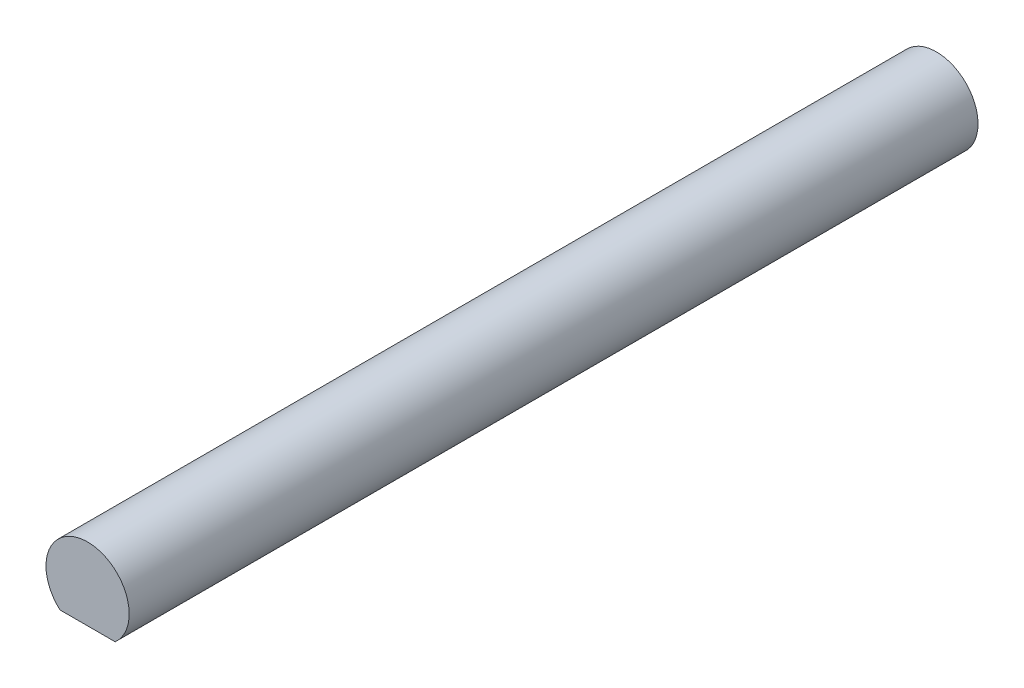
ISO-10303-21;
HEADER;
FILE_DESCRIPTION(('STEP AP214'),'2;1');
FILE_NAME('part.step','',(''),(''),'','','');
FILE_SCHEMA(('AUTOMOTIVE_DESIGN { 1 0 10303 214 1 1 1 1 }'));
ENDSEC;
DATA;
#1=APPLICATION_CONTEXT('core data for automotive mechanical design processes');
#2=APPLICATION_PROTOCOL_DEFINITION('international standard','automotive_design',2000,#1);
#3=PRODUCT_CONTEXT('',#1,'mechanical');
#4=PRODUCT('Part','Part','',(#3));
#5=PRODUCT_RELATED_PRODUCT_CATEGORY('part','',(#4));
#6=PRODUCT_DEFINITION_FORMATION('','',#4);
#7=PRODUCT_DEFINITION_CONTEXT('part definition',#1,'design');
#8=PRODUCT_DEFINITION('design','',#6,#7);
#9=PRODUCT_DEFINITION_SHAPE('','',#8);
#10=(LENGTH_UNIT() NAMED_UNIT(*) SI_UNIT(.MILLI.,.METRE.));
#11=(NAMED_UNIT(*) PLANE_ANGLE_UNIT() SI_UNIT($,.RADIAN.));
#12=(NAMED_UNIT(*) SI_UNIT($,.STERADIAN.) SOLID_ANGLE_UNIT());
#13=UNCERTAINTY_MEASURE_WITH_UNIT(LENGTH_MEASURE(1.E-05),#10,'distance_accuracy_value','');
#14=(GEOMETRIC_REPRESENTATION_CONTEXT(3) GLOBAL_UNCERTAINTY_ASSIGNED_CONTEXT((#13)) GLOBAL_UNIT_ASSIGNED_CONTEXT((#10,
#11,#12)) REPRESENTATION_CONTEXT('',''));
#15=CARTESIAN_POINT('',(0.,0.,0.));
#16=DIRECTION('',(0.,0.,1.));
#17=DIRECTION('',(1.,0.,0.));
#18=AXIS2_PLACEMENT_3D('',#15,#16,#17);
#19=CARTESIAN_POINT('',(0.,0.,30.));
#20=DIRECTION('',(0.,0.,-1.));
#21=DIRECTION('',(-1.,0.,0.));
#22=AXIS2_PLACEMENT_3D('',#19,#20,#21);
#23=CYLINDRICAL_SURFACE('',#22,1.47);
#24=CARTESIAN_POINT('',(0.,0.,0.));
#25=DIRECTION('',(0.,0.,1.));
#26=DIRECTION('',(1.,0.,0.));
#27=AXIS2_PLACEMENT_3D('',#24,#25,#26);
#28=CIRCLE('',#27,1.47);
#29=CARTESIAN_POINT('',(0.975141015443407,-1.1,0.));
#30=VERTEX_POINT('',#29);
#31=CARTESIAN_POINT('',(-0.975141015443407,-1.1,0.));
#32=VERTEX_POINT('',#31);
#33=EDGE_CURVE('E72',#30,#32,#28,.T.);
#34=ORIENTED_EDGE('',*,*,#33,.T.);
#35=DIRECTION('',(0.,0.,-1.));
#36=VECTOR('',#35,1.);
#37=CARTESIAN_POINT('',(-0.975141015443407,-1.1,30.));
#38=LINE('',#37,#36);
#39=CARTESIAN_POINT('',(-0.975141015443407,-1.1,30.));
#40=VERTEX_POINT('',#39);
#41=EDGE_CURVE('E11',#40,#32,#38,.T.);
#42=ORIENTED_EDGE('',*,*,#41,.F.);
#43=CARTESIAN_POINT('',(0.,0.,30.));
#44=DIRECTION('',(0.,0.,1.));
#45=DIRECTION('',(1.,0.,0.));
#46=AXIS2_PLACEMENT_3D('',#43,#44,#45);
#47=CIRCLE('',#46,1.47);
#48=CARTESIAN_POINT('',(0.975141015443407,-1.1,30.));
#49=VERTEX_POINT('',#48);
#50=EDGE_CURVE('E71',#49,#40,#47,.T.);
#51=ORIENTED_EDGE('',*,*,#50,.F.);
#52=DIRECTION('',(0.,0.,-1.));
#53=VECTOR('',#52,1.);
#54=CARTESIAN_POINT('',(0.975141015443407,-1.1,30.));
#55=LINE('',#54,#53);
#56=EDGE_CURVE('E48',#49,#30,#55,.T.);
#57=ORIENTED_EDGE('',*,*,#56,.T.);
#58=EDGE_LOOP('',(#34,#42,#51,#57));
#59=FACE_BOUND('',#58,.T.);
#60=ADVANCED_FACE('F39',(#59),#23,.T.);
#61=CARTESIAN_POINT('',(-0.975141015443407,-1.1,30.));
#62=DIRECTION('',(0.,1.,0.));
#63=DIRECTION('',(0.,0.,1.));
#64=AXIS2_PLACEMENT_3D('',#61,#62,#63);
#65=PLANE('',#64);
#66=DIRECTION('',(1.,0.,0.));
#67=VECTOR('',#66,1.);
#68=CARTESIAN_POINT('',(-0.975141015443407,-1.1,0.));
#69=LINE('',#68,#67);
#70=EDGE_CURVE('E63',#32,#30,#69,.T.);
#71=ORIENTED_EDGE('',*,*,#70,.T.);
#72=ORIENTED_EDGE('',*,*,#56,.F.);
#73=DIRECTION('',(1.,0.,0.));
#74=VECTOR('',#73,1.);
#75=CARTESIAN_POINT('',(-0.975141015443407,-1.1,30.));
#76=LINE('',#75,#74);
#77=EDGE_CURVE('E55',#40,#49,#76,.T.);
#78=ORIENTED_EDGE('',*,*,#77,.F.);
#79=ORIENTED_EDGE('',*,*,#41,.T.);
#80=EDGE_LOOP('',(#71,#72,#78,#79));
#81=FACE_BOUND('',#80,.T.);
#82=ADVANCED_FACE('F66',(#81),#65,.F.);
#83=CARTESIAN_POINT('',(0.,0.,30.));
#84=DIRECTION('',(0.,0.,1.));
#85=DIRECTION('',(1.,0.,0.));
#86=AXIS2_PLACEMENT_3D('',#83,#84,#85);
#87=PLANE('',#86);
#88=ORIENTED_EDGE('',*,*,#50,.T.);
#89=ORIENTED_EDGE('',*,*,#77,.T.);
#90=EDGE_LOOP('',(#88,#89));
#91=FACE_BOUND('',#90,.T.);
#92=ADVANCED_FACE('F83',(#91),#87,.T.);
#93=CARTESIAN_POINT('',(0.,0.,0.));
#94=DIRECTION('',(0.,0.,1.));
#95=DIRECTION('',(1.,0.,0.));
#96=AXIS2_PLACEMENT_3D('',#93,#94,#95);
#97=PLANE('',#96);
#98=ORIENTED_EDGE('',*,*,#33,.F.);
#99=ORIENTED_EDGE('',*,*,#70,.F.);
#100=EDGE_LOOP('',(#98,#99));
#101=FACE_BOUND('',#100,.T.);
#102=ADVANCED_FACE('F76',(#101),#97,.F.);
#103=CLOSED_SHELL('',(#60,#82,#92,#102));
#104=MANIFOLD_SOLID_BREP('B2',#103);
#105=ADVANCED_BREP_SHAPE_REPRESENTATION('',(#18,#104),#14);
#106=SHAPE_DEFINITION_REPRESENTATION(#9,#105);
ENDSEC;
END-ISO-10303-21;
